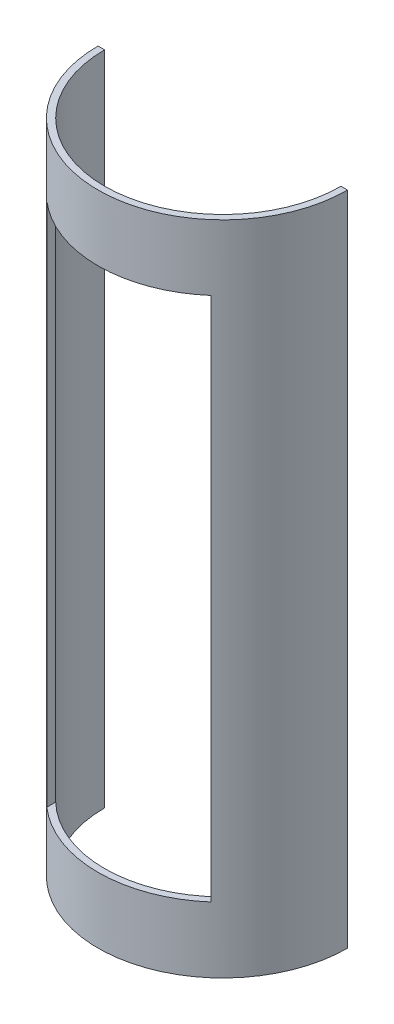
ISO-10303-21;
HEADER;
FILE_DESCRIPTION(('STEP AP214'),'2;1');
FILE_NAME('part.step','',(''),(''),'','','');
FILE_SCHEMA(('AUTOMOTIVE_DESIGN { 1 0 10303 214 1 1 1 1 }'));
ENDSEC;
DATA;
#1=APPLICATION_CONTEXT('core data for automotive mechanical design processes');
#2=APPLICATION_PROTOCOL_DEFINITION('international standard','automotive_design',2000,#1);
#3=PRODUCT_CONTEXT('',#1,'mechanical');
#4=PRODUCT('Part','Part','',(#3));
#5=PRODUCT_RELATED_PRODUCT_CATEGORY('part','',(#4));
#6=PRODUCT_DEFINITION_FORMATION('','',#4);
#7=PRODUCT_DEFINITION_CONTEXT('part definition',#1,'design');
#8=PRODUCT_DEFINITION('design','',#6,#7);
#9=PRODUCT_DEFINITION_SHAPE('','',#8);
#10=(LENGTH_UNIT() NAMED_UNIT(*) SI_UNIT(.MILLI.,.METRE.));
#11=(NAMED_UNIT(*) PLANE_ANGLE_UNIT() SI_UNIT($,.RADIAN.));
#12=(NAMED_UNIT(*) SI_UNIT($,.STERADIAN.) SOLID_ANGLE_UNIT());
#13=UNCERTAINTY_MEASURE_WITH_UNIT(LENGTH_MEASURE(1.E-05),#10,'distance_accuracy_value','');
#14=(GEOMETRIC_REPRESENTATION_CONTEXT(3) GLOBAL_UNCERTAINTY_ASSIGNED_CONTEXT((#13)) GLOBAL_UNIT_ASSIGNED_CONTEXT((#10,
#11,#12)) REPRESENTATION_CONTEXT('',''));
#15=CARTESIAN_POINT('',(0.,0.,0.));
#16=DIRECTION('',(0.,0.,1.));
#17=DIRECTION('',(1.,0.,0.));
#18=AXIS2_PLACEMENT_3D('',#15,#16,#17);
#19=CARTESIAN_POINT('',(19.,50.,0.));
#20=DIRECTION('',(0.,0.,1.));
#21=DIRECTION('',(1.,0.,0.));
#22=AXIS2_PLACEMENT_3D('',#19,#20,#21);
#23=PLANE('',#22);
#24=DIRECTION('',(0.,-1.,0.));
#25=VECTOR('',#24,1.);
#26=CARTESIAN_POINT('',(18.,50.,0.));
#27=LINE('',#26,#25);
#28=CARTESIAN_POINT('',(18.,50.,0.));
#29=VERTEX_POINT('',#28);
#30=CARTESIAN_POINT('',(18.,-50.,0.));
#31=VERTEX_POINT('',#30);
#32=EDGE_CURVE('E61',#29,#31,#27,.T.);
#33=ORIENTED_EDGE('',*,*,#32,.F.);
#34=DIRECTION('',(-1.,0.,0.));
#35=VECTOR('',#34,1.);
#36=CARTESIAN_POINT('',(19.,50.,0.));
#37=LINE('',#36,#35);
#38=CARTESIAN_POINT('',(19.,50.,0.));
#39=VERTEX_POINT('',#38);
#40=EDGE_CURVE('E143',#39,#29,#37,.T.);
#41=ORIENTED_EDGE('',*,*,#40,.F.);
#42=DIRECTION('',(0.,-1.,0.));
#43=VECTOR('',#42,1.);
#44=CARTESIAN_POINT('',(19.,50.,0.));
#45=LINE('',#44,#43);
#46=CARTESIAN_POINT('',(19.,-50.,0.));
#47=VERTEX_POINT('',#46);
#48=EDGE_CURVE('E154',#39,#47,#45,.T.);
#49=ORIENTED_EDGE('',*,*,#48,.T.);
#50=DIRECTION('',(-1.,0.,0.));
#51=VECTOR('',#50,1.);
#52=CARTESIAN_POINT('',(19.,-50.,0.));
#53=LINE('',#52,#51);
#54=EDGE_CURVE('E142',#47,#31,#53,.T.);
#55=ORIENTED_EDGE('',*,*,#54,.T.);
#56=EDGE_LOOP('',(#33,#41,#49,#55));
#57=FACE_BOUND('',#56,.T.);
#58=ADVANCED_FACE('F38',(#57),#23,.F.);
#59=CARTESIAN_POINT('',(0.,50.,0.));
#60=DIRECTION('',(0.,-1.,0.));
#61=DIRECTION('',(0.,0.,-1.));
#62=AXIS2_PLACEMENT_3D('',#59,#60,#61);
#63=CYLINDRICAL_SURFACE('',#62,19.);
#64=CARTESIAN_POINT('',(0.,40.,0.));
#65=DIRECTION('',(0.,1.,0.));
#66=DIRECTION('',(0.,0.,1.));
#67=AXIS2_PLACEMENT_3D('',#64,#65,#66);
#68=CIRCLE('',#67,19.);
#69=CARTESIAN_POINT('',(-12.5,40.,14.3090880212542));
#70=VERTEX_POINT('',#69);
#71=CARTESIAN_POINT('',(12.5,40.,14.3090880212542));
#72=VERTEX_POINT('',#71);
#73=EDGE_CURVE('E100',#70,#72,#68,.T.);
#74=ORIENTED_EDGE('',*,*,#73,.T.);
#75=DIRECTION('',(0.,-1.,0.));
#76=VECTOR('',#75,1.);
#77=CARTESIAN_POINT('',(12.5,50.,14.3090880212542));
#78=LINE('',#77,#76);
#79=CARTESIAN_POINT('',(12.5,-40.,14.3090880212542));
#80=VERTEX_POINT('',#79);
#81=EDGE_CURVE('E124',#72,#80,#78,.T.);
#82=ORIENTED_EDGE('',*,*,#81,.T.);
#83=CARTESIAN_POINT('',(0.,-40.,0.));
#84=DIRECTION('',(0.,-1.,0.));
#85=DIRECTION('',(0.,0.,-1.));
#86=AXIS2_PLACEMENT_3D('',#83,#84,#85);
#87=CIRCLE('',#86,19.);
#88=CARTESIAN_POINT('',(-12.5,-40.,14.3090880212542));
#89=VERTEX_POINT('',#88);
#90=EDGE_CURVE('E122',#80,#89,#87,.T.);
#91=ORIENTED_EDGE('',*,*,#90,.T.);
#92=DIRECTION('',(0.,-1.,0.));
#93=VECTOR('',#92,1.);
#94=CARTESIAN_POINT('',(-12.5,50.,14.3090880212542));
#95=LINE('',#94,#93);
#96=EDGE_CURVE('E108',#89,#70,#95,.F.);
#97=ORIENTED_EDGE('',*,*,#96,.T.);
#98=EDGE_LOOP('',(#74,#82,#91,#97));
#99=FACE_BOUND('',#98,.T.);
#100=CARTESIAN_POINT('',(0.,-50.,0.));
#101=DIRECTION('',(0.,1.,0.));
#102=DIRECTION('',(0.,0.,1.));
#103=AXIS2_PLACEMENT_3D('',#100,#101,#102);
#104=CIRCLE('',#103,19.);
#105=CARTESIAN_POINT('',(-19.,-50.,0.));
#106=VERTEX_POINT('',#105);
#107=EDGE_CURVE('E137',#106,#47,#104,.T.);
#108=ORIENTED_EDGE('',*,*,#107,.T.);
#109=ORIENTED_EDGE('',*,*,#48,.F.);
#110=CARTESIAN_POINT('',(0.,50.,0.));
#111=DIRECTION('',(0.,1.,0.));
#112=DIRECTION('',(0.,0.,1.));
#113=AXIS2_PLACEMENT_3D('',#110,#111,#112);
#114=CIRCLE('',#113,19.);
#115=CARTESIAN_POINT('',(-19.,50.,0.));
#116=VERTEX_POINT('',#115);
#117=EDGE_CURVE('E138',#116,#39,#114,.T.);
#118=ORIENTED_EDGE('',*,*,#117,.F.);
#119=DIRECTION('',(0.,-1.,0.));
#120=VECTOR('',#119,1.);
#121=CARTESIAN_POINT('',(-19.,50.,0.));
#122=LINE('',#121,#120);
#123=EDGE_CURVE('E146',#116,#106,#122,.T.);
#124=ORIENTED_EDGE('',*,*,#123,.T.);
#125=EDGE_LOOP('',(#108,#109,#118,#124));
#126=FACE_BOUND('',#125,.T.);
#127=ADVANCED_FACE('F40',(#99,#126),#63,.T.);
#128=CARTESIAN_POINT('',(-18.,50.,0.));
#129=VERTEX_POINT('',#128);
#130=EDGE_CURVE('E141',#129,#116,#37,.T.);
#131=ORIENTED_EDGE('',*,*,#130,.F.);
#132=DIRECTION('',(0.,-1.,0.));
#133=VECTOR('',#132,1.);
#134=CARTESIAN_POINT('',(-18.,50.,0.));
#135=LINE('',#134,#133);
#136=CARTESIAN_POINT('',(-18.,-50.,0.));
#137=VERTEX_POINT('',#136);
#138=EDGE_CURVE('E132',#129,#137,#135,.T.);
#139=ORIENTED_EDGE('',*,*,#138,.T.);
#140=EDGE_CURVE('E149',#137,#106,#53,.T.);
#141=ORIENTED_EDGE('',*,*,#140,.T.);
#142=ORIENTED_EDGE('',*,*,#123,.F.);
#143=EDGE_LOOP('',(#131,#139,#141,#142));
#144=FACE_BOUND('',#143,.T.);
#145=ADVANCED_FACE('F183',(#144),#23,.F.);
#146=CARTESIAN_POINT('',(0.,50.,0.));
#147=DIRECTION('',(0.,1.,0.));
#148=DIRECTION('',(0.,0.,1.));
#149=AXIS2_PLACEMENT_3D('',#146,#147,#148);
#150=PLANE('',#149);
#151=CARTESIAN_POINT('',(0.,50.,0.));
#152=DIRECTION('',(0.,1.,0.));
#153=DIRECTION('',(0.,0.,1.));
#154=AXIS2_PLACEMENT_3D('',#151,#152,#153);
#155=CIRCLE('',#154,18.);
#156=EDGE_CURVE('E131',#129,#29,#155,.T.);
#157=ORIENTED_EDGE('',*,*,#156,.F.);
#158=ORIENTED_EDGE('',*,*,#130,.T.);
#159=ORIENTED_EDGE('',*,*,#117,.T.);
#160=ORIENTED_EDGE('',*,*,#40,.T.);
#161=EDGE_LOOP('',(#157,#158,#159,#160));
#162=FACE_BOUND('',#161,.T.);
#163=ADVANCED_FACE('F189',(#162),#150,.T.);
#164=CARTESIAN_POINT('',(0.,-50.,0.));
#165=DIRECTION('',(0.,1.,0.));
#166=DIRECTION('',(0.,0.,1.));
#167=AXIS2_PLACEMENT_3D('',#164,#165,#166);
#168=PLANE('',#167);
#169=ORIENTED_EDGE('',*,*,#140,.F.);
#170=CARTESIAN_POINT('',(0.,-50.,0.));
#171=DIRECTION('',(0.,1.,0.));
#172=DIRECTION('',(0.,0.,1.));
#173=AXIS2_PLACEMENT_3D('',#170,#171,#172);
#174=CIRCLE('',#173,18.);
#175=EDGE_CURVE('E129',#137,#31,#174,.T.);
#176=ORIENTED_EDGE('',*,*,#175,.T.);
#177=ORIENTED_EDGE('',*,*,#54,.F.);
#178=ORIENTED_EDGE('',*,*,#107,.F.);
#179=EDGE_LOOP('',(#169,#176,#177,#178));
#180=FACE_BOUND('',#179,.T.);
#181=ADVANCED_FACE('F178',(#180),#168,.F.);
#182=CARTESIAN_POINT('',(0.,50.,0.));
#183=DIRECTION('',(0.,-1.,0.));
#184=DIRECTION('',(0.,0.,-1.));
#185=AXIS2_PLACEMENT_3D('',#182,#183,#184);
#186=CYLINDRICAL_SURFACE('',#185,18.);
#187=DIRECTION('',(0.,-1.,0.));
#188=VECTOR('',#187,1.);
#189=CARTESIAN_POINT('',(12.5,50.,12.9518338469886));
#190=LINE('',#189,#188);
#191=CARTESIAN_POINT('',(12.5,40.,12.9518338469886));
#192=VERTEX_POINT('',#191);
#193=CARTESIAN_POINT('',(12.5,-40.,12.9518338469886));
#194=VERTEX_POINT('',#193);
#195=EDGE_CURVE('E11',#192,#194,#190,.T.);
#196=ORIENTED_EDGE('',*,*,#195,.F.);
#197=CARTESIAN_POINT('',(0.,40.,0.));
#198=DIRECTION('',(0.,1.,0.));
#199=DIRECTION('',(0.,0.,1.));
#200=AXIS2_PLACEMENT_3D('',#197,#198,#199);
#201=CIRCLE('',#200,18.);
#202=CARTESIAN_POINT('',(-12.5,40.,12.9518338469886));
#203=VERTEX_POINT('',#202);
#204=EDGE_CURVE('E157',#203,#192,#201,.T.);
#205=ORIENTED_EDGE('',*,*,#204,.F.);
#206=DIRECTION('',(0.,-1.,0.));
#207=VECTOR('',#206,1.);
#208=CARTESIAN_POINT('',(-12.5,50.,12.9518338469886));
#209=LINE('',#208,#207);
#210=CARTESIAN_POINT('',(-12.5,-40.,12.9518338469886));
#211=VERTEX_POINT('',#210);
#212=EDGE_CURVE('E117',#211,#203,#209,.F.);
#213=ORIENTED_EDGE('',*,*,#212,.F.);
#214=CARTESIAN_POINT('',(0.,-40.,0.));
#215=DIRECTION('',(0.,-1.,0.));
#216=DIRECTION('',(0.,0.,-1.));
#217=AXIS2_PLACEMENT_3D('',#214,#215,#216);
#218=CIRCLE('',#217,18.);
#219=EDGE_CURVE('E46',#194,#211,#218,.T.);
#220=ORIENTED_EDGE('',*,*,#219,.F.);
#221=EDGE_LOOP('',(#196,#205,#213,#220));
#222=FACE_BOUND('',#221,.T.);
#223=ORIENTED_EDGE('',*,*,#175,.F.);
#224=ORIENTED_EDGE('',*,*,#138,.F.);
#225=ORIENTED_EDGE('',*,*,#156,.T.);
#226=ORIENTED_EDGE('',*,*,#32,.T.);
#227=EDGE_LOOP('',(#223,#224,#225,#226));
#228=FACE_BOUND('',#227,.T.);
#229=ADVANCED_FACE('F167',(#222,#228),#186,.F.);
#230=CARTESIAN_POINT('',(12.5,-40.,-1.2E-05));
#231=DIRECTION('',(1.,0.,0.));
#232=DIRECTION('',(0.,0.,-1.));
#233=AXIS2_PLACEMENT_3D('',#230,#231,#232);
#234=PLANE('',#233);
#235=DIRECTION('',(0.,0.,1.));
#236=VECTOR('',#235,1.);
#237=CARTESIAN_POINT('',(12.5,40.,-1.2E-05));
#238=LINE('',#237,#236);
#239=EDGE_CURVE('E103',#192,#72,#238,.T.);
#240=ORIENTED_EDGE('',*,*,#239,.F.);
#241=ORIENTED_EDGE('',*,*,#195,.T.);
#242=DIRECTION('',(0.,0.,1.));
#243=VECTOR('',#242,1.);
#244=CARTESIAN_POINT('',(12.5,-40.,-1.2E-05));
#245=LINE('',#244,#243);
#246=EDGE_CURVE('E109',#194,#80,#245,.T.);
#247=ORIENTED_EDGE('',*,*,#246,.T.);
#248=ORIENTED_EDGE('',*,*,#81,.F.);
#249=EDGE_LOOP('',(#240,#241,#247,#248));
#250=FACE_BOUND('',#249,.T.);
#251=ADVANCED_FACE('F169',(#250),#234,.F.);
#252=CARTESIAN_POINT('',(-12.5,-40.,-1.2E-05));
#253=DIRECTION('',(0.,-1.,0.));
#254=DIRECTION('',(0.,0.,-1.));
#255=AXIS2_PLACEMENT_3D('',#252,#253,#254);
#256=PLANE('',#255);
#257=ORIENTED_EDGE('',*,*,#246,.F.);
#258=ORIENTED_EDGE('',*,*,#219,.T.);
#259=DIRECTION('',(0.,0.,1.));
#260=VECTOR('',#259,1.);
#261=CARTESIAN_POINT('',(-12.5,-40.,-1.2E-05));
#262=LINE('',#261,#260);
#263=EDGE_CURVE('E119',#211,#89,#262,.T.);
#264=ORIENTED_EDGE('',*,*,#263,.T.);
#265=ORIENTED_EDGE('',*,*,#90,.F.);
#266=EDGE_LOOP('',(#257,#258,#264,#265));
#267=FACE_BOUND('',#266,.T.);
#268=ADVANCED_FACE('F162',(#267),#256,.F.);
#269=CARTESIAN_POINT('',(-12.5,-40.,-1.2E-05));
#270=DIRECTION('',(-1.,0.,0.));
#271=DIRECTION('',(0.,0.,1.));
#272=AXIS2_PLACEMENT_3D('',#269,#270,#271);
#273=PLANE('',#272);
#274=ORIENTED_EDGE('',*,*,#263,.F.);
#275=ORIENTED_EDGE('',*,*,#212,.T.);
#276=DIRECTION('',(0.,0.,1.));
#277=VECTOR('',#276,1.);
#278=CARTESIAN_POINT('',(-12.5,40.,-1.2E-05));
#279=LINE('',#278,#277);
#280=EDGE_CURVE('E53',#203,#70,#279,.T.);
#281=ORIENTED_EDGE('',*,*,#280,.T.);
#282=ORIENTED_EDGE('',*,*,#96,.F.);
#283=EDGE_LOOP('',(#274,#275,#281,#282));
#284=FACE_BOUND('',#283,.T.);
#285=ADVANCED_FACE('F114',(#284),#273,.F.);
#286=CARTESIAN_POINT('',(-12.5,40.,-1.2E-05));
#287=DIRECTION('',(0.,1.,0.));
#288=DIRECTION('',(0.,0.,1.));
#289=AXIS2_PLACEMENT_3D('',#286,#287,#288);
#290=PLANE('',#289);
#291=ORIENTED_EDGE('',*,*,#73,.F.);
#292=ORIENTED_EDGE('',*,*,#280,.F.);
#293=ORIENTED_EDGE('',*,*,#204,.T.);
#294=ORIENTED_EDGE('',*,*,#239,.T.);
#295=EDGE_LOOP('',(#291,#292,#293,#294));
#296=FACE_BOUND('',#295,.T.);
#297=ADVANCED_FACE('F101',(#296),#290,.F.);
#298=CLOSED_SHELL('',(#58,#127,#145,#163,#181,#229,#251,#268,#285,#297));
#299=MANIFOLD_SOLID_BREP('B2',#298);
#300=ADVANCED_BREP_SHAPE_REPRESENTATION('',(#18,#299),#14);
#301=SHAPE_DEFINITION_REPRESENTATION(#9,#300);
ENDSEC;
END-ISO-10303-21;
